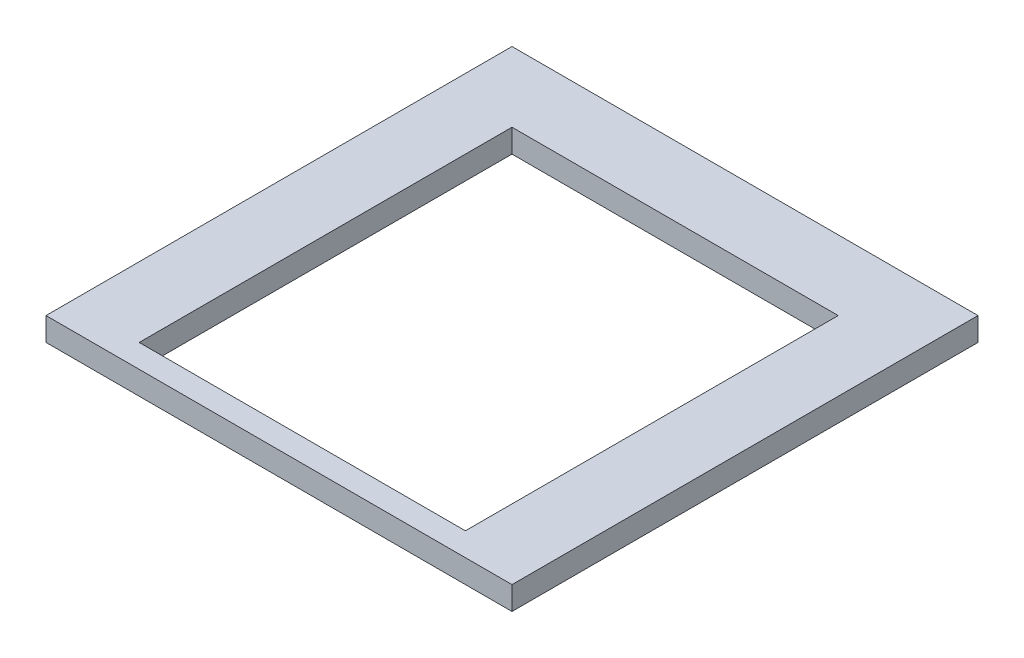
ISO-10303-21;
HEADER;
FILE_DESCRIPTION(('STEP AP214'),'2;1');
FILE_NAME('part.step','',(''),(''),'','','');
FILE_SCHEMA(('AUTOMOTIVE_DESIGN { 1 0 10303 214 1 1 1 1 }'));
ENDSEC;
DATA;
#1=APPLICATION_CONTEXT('core data for automotive mechanical design processes');
#2=APPLICATION_PROTOCOL_DEFINITION('international standard','automotive_design',2000,#1);
#3=PRODUCT_CONTEXT('',#1,'mechanical');
#4=PRODUCT('Part','Part','',(#3));
#5=PRODUCT_RELATED_PRODUCT_CATEGORY('part','',(#4));
#6=PRODUCT_DEFINITION_FORMATION('','',#4);
#7=PRODUCT_DEFINITION_CONTEXT('part definition',#1,'design');
#8=PRODUCT_DEFINITION('design','',#6,#7);
#9=PRODUCT_DEFINITION_SHAPE('','',#8);
#10=(LENGTH_UNIT() NAMED_UNIT(*) SI_UNIT(.MILLI.,.METRE.));
#11=(NAMED_UNIT(*) PLANE_ANGLE_UNIT() SI_UNIT($,.RADIAN.));
#12=(NAMED_UNIT(*) SI_UNIT($,.STERADIAN.) SOLID_ANGLE_UNIT());
#13=UNCERTAINTY_MEASURE_WITH_UNIT(LENGTH_MEASURE(1.E-05),#10,'distance_accuracy_value','');
#14=(GEOMETRIC_REPRESENTATION_CONTEXT(3) GLOBAL_UNCERTAINTY_ASSIGNED_CONTEXT((#13)) GLOBAL_UNIT_ASSIGNED_CONTEXT((#10,
#11,#12)) REPRESENTATION_CONTEXT('',''));
#15=CARTESIAN_POINT('',(0.,0.,0.));
#16=DIRECTION('',(0.,0.,1.));
#17=DIRECTION('',(1.,0.,0.));
#18=AXIS2_PLACEMENT_3D('',#15,#16,#17);
#19=CARTESIAN_POINT('',(0.,7.,0.));
#20=DIRECTION('',(0.,1.,0.));
#21=DIRECTION('',(0.,0.,1.));
#22=AXIS2_PLACEMENT_3D('',#19,#20,#21);
#23=PLANE('',#22);
#24=DIRECTION('',(0.,0.,1.));
#25=VECTOR('',#24,1.);
#26=CARTESIAN_POINT('',(-10.,7.,10.));
#27=LINE('',#26,#25);
#28=CARTESIAN_POINT('',(-10.,7.,-10.));
#29=VERTEX_POINT('',#28);
#30=CARTESIAN_POINT('',(-10.,7.,10.));
#31=VERTEX_POINT('',#30);
#32=EDGE_CURVE('E135',#29,#31,#27,.T.);
#33=ORIENTED_EDGE('',*,*,#32,.T.);
#34=DIRECTION('',(1.,0.,0.));
#35=VECTOR('',#34,1.);
#36=CARTESIAN_POINT('',(10.,7.,10.));
#37=LINE('',#36,#35);
#38=CARTESIAN_POINT('',(10.,7.,10.));
#39=VERTEX_POINT('',#38);
#40=EDGE_CURVE('E138',#31,#39,#37,.T.);
#41=ORIENTED_EDGE('',*,*,#40,.T.);
#42=DIRECTION('',(0.,0.,-1.));
#43=VECTOR('',#42,1.);
#44=CARTESIAN_POINT('',(10.,7.,10.));
#45=LINE('',#44,#43);
#46=CARTESIAN_POINT('',(10.,7.,-10.));
#47=VERTEX_POINT('',#46);
#48=EDGE_CURVE('E141',#39,#47,#45,.T.);
#49=ORIENTED_EDGE('',*,*,#48,.T.);
#50=DIRECTION('',(-1.,0.,0.));
#51=VECTOR('',#50,1.);
#52=CARTESIAN_POINT('',(10.,7.,-10.));
#53=LINE('',#52,#51);
#54=EDGE_CURVE('E143',#47,#29,#53,.T.);
#55=ORIENTED_EDGE('',*,*,#54,.T.);
#56=EDGE_LOOP('',(#33,#41,#49,#55));
#57=FACE_BOUND('',#56,.T.);
#58=DIRECTION('',(1.,0.,0.));
#59=VECTOR('',#58,1.);
#60=CARTESIAN_POINT('',(0.,7.,-7.));
#61=LINE('',#60,#59);
#62=CARTESIAN_POINT('',(-7.,7.,-7.));
#63=VERTEX_POINT('',#62);
#64=CARTESIAN_POINT('',(7.,7.,-7.));
#65=VERTEX_POINT('',#64);
#66=EDGE_CURVE('E107',#63,#65,#61,.T.);
#67=ORIENTED_EDGE('',*,*,#66,.T.);
#68=DIRECTION('',(0.,0.,1.));
#69=VECTOR('',#68,1.);
#70=CARTESIAN_POINT('',(7.,7.,0.));
#71=LINE('',#70,#69);
#72=CARTESIAN_POINT('',(7.00000000000001,7.,9.));
#73=VERTEX_POINT('',#72);
#74=EDGE_CURVE('E48',#65,#73,#71,.T.);
#75=ORIENTED_EDGE('',*,*,#74,.T.);
#76=DIRECTION('',(-1.,0.,0.));
#77=VECTOR('',#76,1.);
#78=CARTESIAN_POINT('',(0.,7.,9.));
#79=LINE('',#78,#77);
#80=CARTESIAN_POINT('',(-7.,7.,9.));
#81=VERTEX_POINT('',#80);
#82=EDGE_CURVE('E113',#73,#81,#79,.T.);
#83=ORIENTED_EDGE('',*,*,#82,.T.);
#84=DIRECTION('',(0.,0.,-1.));
#85=VECTOR('',#84,1.);
#86=CARTESIAN_POINT('',(-7.,7.,0.));
#87=LINE('',#86,#85);
#88=EDGE_CURVE('E127',#81,#63,#87,.T.);
#89=ORIENTED_EDGE('',*,*,#88,.T.);
#90=EDGE_LOOP('',(#67,#75,#83,#89));
#91=FACE_BOUND('',#90,.T.);
#92=ADVANCED_FACE('F33',(#57,#91),#23,.T.);
#93=CARTESIAN_POINT('',(0.,6.,0.));
#94=DIRECTION('',(0.,1.,0.));
#95=DIRECTION('',(0.,0.,1.));
#96=AXIS2_PLACEMENT_3D('',#93,#94,#95);
#97=PLANE('',#96);
#98=DIRECTION('',(0.,0.,1.));
#99=VECTOR('',#98,1.);
#100=CARTESIAN_POINT('',(-10.,6.,10.));
#101=LINE('',#100,#99);
#102=CARTESIAN_POINT('',(-10.,6.,-10.));
#103=VERTEX_POINT('',#102);
#104=CARTESIAN_POINT('',(-10.,6.,10.));
#105=VERTEX_POINT('',#104);
#106=EDGE_CURVE('E114',#103,#105,#101,.T.);
#107=ORIENTED_EDGE('',*,*,#106,.F.);
#108=DIRECTION('',(-1.,0.,0.));
#109=VECTOR('',#108,1.);
#110=CARTESIAN_POINT('',(10.,6.,-10.));
#111=LINE('',#110,#109);
#112=CARTESIAN_POINT('',(10.,6.,-10.));
#113=VERTEX_POINT('',#112);
#114=EDGE_CURVE('E139',#113,#103,#111,.T.);
#115=ORIENTED_EDGE('',*,*,#114,.F.);
#116=DIRECTION('',(0.,0.,-1.));
#117=VECTOR('',#116,1.);
#118=CARTESIAN_POINT('',(10.,6.,10.));
#119=LINE('',#118,#117);
#120=CARTESIAN_POINT('',(10.,6.,10.));
#121=VERTEX_POINT('',#120);
#122=EDGE_CURVE('E150',#121,#113,#119,.T.);
#123=ORIENTED_EDGE('',*,*,#122,.F.);
#124=DIRECTION('',(1.,0.,0.));
#125=VECTOR('',#124,1.);
#126=CARTESIAN_POINT('',(10.,6.,10.));
#127=LINE('',#126,#125);
#128=EDGE_CURVE('E148',#105,#121,#127,.T.);
#129=ORIENTED_EDGE('',*,*,#128,.F.);
#130=EDGE_LOOP('',(#107,#115,#123,#129));
#131=FACE_BOUND('',#130,.T.);
#132=DIRECTION('',(0.,0.,1.));
#133=VECTOR('',#132,1.);
#134=CARTESIAN_POINT('',(7.,6.,0.));
#135=LINE('',#134,#133);
#136=CARTESIAN_POINT('',(7.,6.,-7.));
#137=VERTEX_POINT('',#136);
#138=CARTESIAN_POINT('',(7.00000000000001,6.,9.));
#139=VERTEX_POINT('',#138);
#140=EDGE_CURVE('E98',#137,#139,#135,.T.);
#141=ORIENTED_EDGE('',*,*,#140,.F.);
#142=DIRECTION('',(1.,0.,0.));
#143=VECTOR('',#142,1.);
#144=CARTESIAN_POINT('',(0.,6.,-7.));
#145=LINE('',#144,#143);
#146=CARTESIAN_POINT('',(-7.,6.,-7.));
#147=VERTEX_POINT('',#146);
#148=EDGE_CURVE('E121',#147,#137,#145,.T.);
#149=ORIENTED_EDGE('',*,*,#148,.F.);
#150=DIRECTION('',(0.,0.,-1.));
#151=VECTOR('',#150,1.);
#152=CARTESIAN_POINT('',(-7.,6.,0.));
#153=LINE('',#152,#151);
#154=CARTESIAN_POINT('',(-7.,6.,9.));
#155=VERTEX_POINT('',#154);
#156=EDGE_CURVE('E119',#155,#147,#153,.T.);
#157=ORIENTED_EDGE('',*,*,#156,.F.);
#158=DIRECTION('',(-1.,0.,0.));
#159=VECTOR('',#158,1.);
#160=CARTESIAN_POINT('',(0.,6.,9.));
#161=LINE('',#160,#159);
#162=EDGE_CURVE('E106',#139,#155,#161,.T.);
#163=ORIENTED_EDGE('',*,*,#162,.F.);
#164=EDGE_LOOP('',(#141,#149,#157,#163));
#165=FACE_BOUND('',#164,.T.);
#166=ADVANCED_FACE('F118',(#131,#165),#97,.F.);
#167=CARTESIAN_POINT('',(-10.,7.,10.));
#168=DIRECTION('',(1.,0.,0.));
#169=DIRECTION('',(0.,0.,-1.));
#170=AXIS2_PLACEMENT_3D('',#167,#168,#169);
#171=PLANE('',#170);
#172=ORIENTED_EDGE('',*,*,#106,.T.);
#173=DIRECTION('',(0.,-1.,0.));
#174=VECTOR('',#173,1.);
#175=CARTESIAN_POINT('',(-10.,7.,10.));
#176=LINE('',#175,#174);
#177=EDGE_CURVE('E11',#31,#105,#176,.T.);
#178=ORIENTED_EDGE('',*,*,#177,.F.);
#179=ORIENTED_EDGE('',*,*,#32,.F.);
#180=DIRECTION('',(0.,-1.,0.));
#181=VECTOR('',#180,1.);
#182=CARTESIAN_POINT('',(-10.,7.,-10.));
#183=LINE('',#182,#181);
#184=EDGE_CURVE('E145',#29,#103,#183,.T.);
#185=ORIENTED_EDGE('',*,*,#184,.T.);
#186=EDGE_LOOP('',(#172,#178,#179,#185));
#187=FACE_BOUND('',#186,.T.);
#188=ADVANCED_FACE('F35',(#187),#171,.F.);
#189=CARTESIAN_POINT('',(10.,7.,10.));
#190=DIRECTION('',(0.,0.,-1.));
#191=DIRECTION('',(-1.,0.,0.));
#192=AXIS2_PLACEMENT_3D('',#189,#190,#191);
#193=PLANE('',#192);
#194=ORIENTED_EDGE('',*,*,#128,.T.);
#195=DIRECTION('',(0.,-1.,0.));
#196=VECTOR('',#195,1.);
#197=CARTESIAN_POINT('',(10.,7.,10.));
#198=LINE('',#197,#196);
#199=EDGE_CURVE('E41',#39,#121,#198,.T.);
#200=ORIENTED_EDGE('',*,*,#199,.F.);
#201=ORIENTED_EDGE('',*,*,#40,.F.);
#202=ORIENTED_EDGE('',*,*,#177,.T.);
#203=EDGE_LOOP('',(#194,#200,#201,#202));
#204=FACE_BOUND('',#203,.T.);
#205=ADVANCED_FACE('F177',(#204),#193,.F.);
#206=CARTESIAN_POINT('',(10.,7.,10.));
#207=DIRECTION('',(-1.,0.,0.));
#208=DIRECTION('',(0.,0.,1.));
#209=AXIS2_PLACEMENT_3D('',#206,#207,#208);
#210=PLANE('',#209);
#211=ORIENTED_EDGE('',*,*,#122,.T.);
#212=DIRECTION('',(0.,-1.,0.));
#213=VECTOR('',#212,1.);
#214=CARTESIAN_POINT('',(10.,7.,-10.));
#215=LINE('',#214,#213);
#216=EDGE_CURVE('E155',#47,#113,#215,.T.);
#217=ORIENTED_EDGE('',*,*,#216,.F.);
#218=ORIENTED_EDGE('',*,*,#48,.F.);
#219=ORIENTED_EDGE('',*,*,#199,.T.);
#220=EDGE_LOOP('',(#211,#217,#218,#219));
#221=FACE_BOUND('',#220,.T.);
#222=ADVANCED_FACE('F162',(#221),#210,.F.);
#223=CARTESIAN_POINT('',(10.,7.,-10.));
#224=DIRECTION('',(0.,0.,1.));
#225=DIRECTION('',(1.,0.,0.));
#226=AXIS2_PLACEMENT_3D('',#223,#224,#225);
#227=PLANE('',#226);
#228=ORIENTED_EDGE('',*,*,#114,.T.);
#229=ORIENTED_EDGE('',*,*,#184,.F.);
#230=ORIENTED_EDGE('',*,*,#54,.F.);
#231=ORIENTED_EDGE('',*,*,#216,.T.);
#232=EDGE_LOOP('',(#228,#229,#230,#231));
#233=FACE_BOUND('',#232,.T.);
#234=ADVANCED_FACE('F170',(#233),#227,.F.);
#235=CARTESIAN_POINT('',(7.,6.,0.));
#236=DIRECTION('',(-1.,0.,0.));
#237=DIRECTION('',(0.,0.,1.));
#238=AXIS2_PLACEMENT_3D('',#235,#236,#237);
#239=PLANE('',#238);
#240=ORIENTED_EDGE('',*,*,#74,.F.);
#241=DIRECTION('',(0.,1.,0.));
#242=VECTOR('',#241,1.);
#243=CARTESIAN_POINT('',(7.,6.,-7.));
#244=LINE('',#243,#242);
#245=EDGE_CURVE('E102',#137,#65,#244,.T.);
#246=ORIENTED_EDGE('',*,*,#245,.F.);
#247=ORIENTED_EDGE('',*,*,#140,.T.);
#248=DIRECTION('',(0.,1.,0.));
#249=VECTOR('',#248,1.);
#250=CARTESIAN_POINT('',(7.00000000000001,6.,9.));
#251=LINE('',#250,#249);
#252=EDGE_CURVE('E101',#139,#73,#251,.T.);
#253=ORIENTED_EDGE('',*,*,#252,.T.);
#254=EDGE_LOOP('',(#240,#246,#247,#253));
#255=FACE_BOUND('',#254,.T.);
#256=ADVANCED_FACE('F100',(#255),#239,.T.);
#257=CARTESIAN_POINT('',(0.,6.,9.));
#258=DIRECTION('',(0.,0.,-1.));
#259=DIRECTION('',(-1.,0.,0.));
#260=AXIS2_PLACEMENT_3D('',#257,#258,#259);
#261=PLANE('',#260);
#262=ORIENTED_EDGE('',*,*,#82,.F.);
#263=ORIENTED_EDGE('',*,*,#252,.F.);
#264=ORIENTED_EDGE('',*,*,#162,.T.);
#265=DIRECTION('',(0.,1.,0.));
#266=VECTOR('',#265,1.);
#267=CARTESIAN_POINT('',(-7.,6.,9.));
#268=LINE('',#267,#266);
#269=EDGE_CURVE('E115',#155,#81,#268,.T.);
#270=ORIENTED_EDGE('',*,*,#269,.T.);
#271=EDGE_LOOP('',(#262,#263,#264,#270));
#272=FACE_BOUND('',#271,.T.);
#273=ADVANCED_FACE('F110',(#272),#261,.T.);
#274=CARTESIAN_POINT('',(-7.,6.,0.));
#275=DIRECTION('',(1.,0.,0.));
#276=DIRECTION('',(0.,0.,-1.));
#277=AXIS2_PLACEMENT_3D('',#274,#275,#276);
#278=PLANE('',#277);
#279=ORIENTED_EDGE('',*,*,#88,.F.);
#280=ORIENTED_EDGE('',*,*,#269,.F.);
#281=ORIENTED_EDGE('',*,*,#156,.T.);
#282=DIRECTION('',(0.,1.,0.));
#283=VECTOR('',#282,1.);
#284=CARTESIAN_POINT('',(-7.,6.,-7.));
#285=LINE('',#284,#283);
#286=EDGE_CURVE('E56',#147,#63,#285,.T.);
#287=ORIENTED_EDGE('',*,*,#286,.T.);
#288=EDGE_LOOP('',(#279,#280,#281,#287));
#289=FACE_BOUND('',#288,.T.);
#290=ADVANCED_FACE('F200',(#289),#278,.T.);
#291=CARTESIAN_POINT('',(0.,6.,-7.));
#292=DIRECTION('',(0.,0.,1.));
#293=DIRECTION('',(1.,0.,0.));
#294=AXIS2_PLACEMENT_3D('',#291,#292,#293);
#295=PLANE('',#294);
#296=ORIENTED_EDGE('',*,*,#66,.F.);
#297=ORIENTED_EDGE('',*,*,#286,.F.);
#298=ORIENTED_EDGE('',*,*,#148,.T.);
#299=ORIENTED_EDGE('',*,*,#245,.T.);
#300=EDGE_LOOP('',(#296,#297,#298,#299));
#301=FACE_BOUND('',#300,.T.);
#302=ADVANCED_FACE('F204',(#301),#295,.T.);
#303=CLOSED_SHELL('',(#92,#166,#188,#205,#222,#234,#256,#273,#290,#302));
#304=MANIFOLD_SOLID_BREP('B2',#303);
#305=ADVANCED_BREP_SHAPE_REPRESENTATION('',(#18,#304),#14);
#306=SHAPE_DEFINITION_REPRESENTATION(#9,#305);
ENDSEC;
END-ISO-10303-21;
